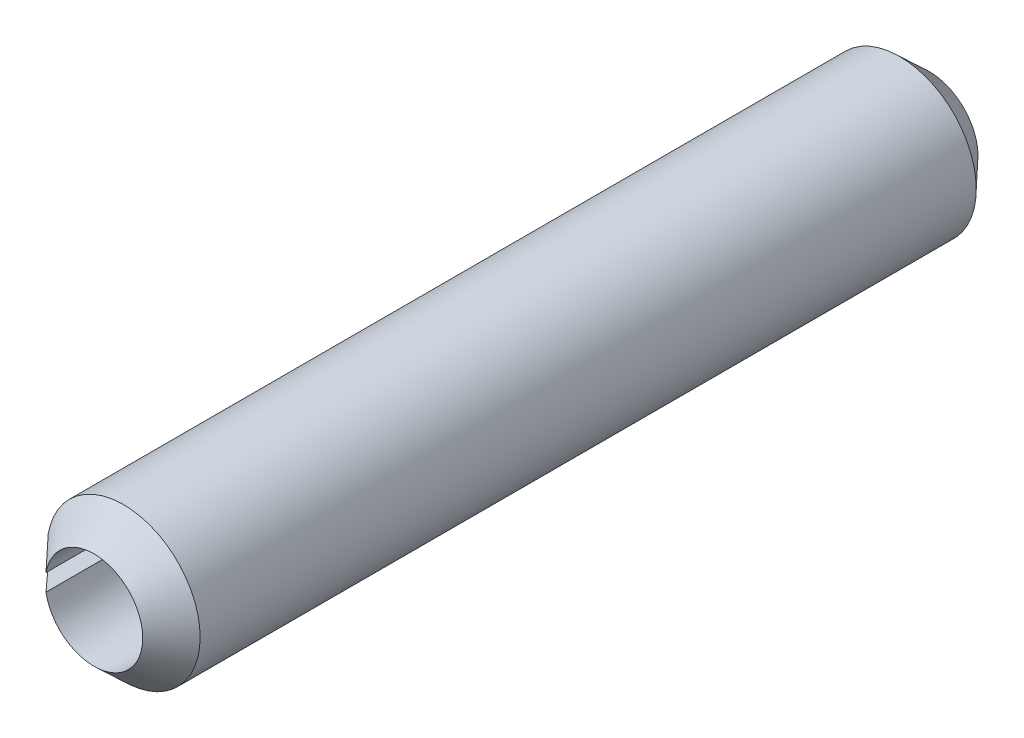
ISO-10303-21;
HEADER;
FILE_DESCRIPTION(('STEP AP214'),'2;1');
FILE_NAME('part.step','',(''),(''),'','','');
FILE_SCHEMA(('AUTOMOTIVE_DESIGN { 1 0 10303 214 1 1 1 1 }'));
ENDSEC;
DATA;
#1=APPLICATION_CONTEXT('core data for automotive mechanical design processes');
#2=APPLICATION_PROTOCOL_DEFINITION('international standard','automotive_design',2000,#1);
#3=PRODUCT_CONTEXT('',#1,'mechanical');
#4=PRODUCT('Part','Part','',(#3));
#5=PRODUCT_RELATED_PRODUCT_CATEGORY('part','',(#4));
#6=PRODUCT_DEFINITION_FORMATION('','',#4);
#7=PRODUCT_DEFINITION_CONTEXT('part definition',#1,'design');
#8=PRODUCT_DEFINITION('design','',#6,#7);
#9=PRODUCT_DEFINITION_SHAPE('','',#8);
#10=(LENGTH_UNIT() NAMED_UNIT(*) SI_UNIT(.MILLI.,.METRE.));
#11=(NAMED_UNIT(*) PLANE_ANGLE_UNIT() SI_UNIT($,.RADIAN.));
#12=(NAMED_UNIT(*) SI_UNIT($,.STERADIAN.) SOLID_ANGLE_UNIT());
#13=UNCERTAINTY_MEASURE_WITH_UNIT(LENGTH_MEASURE(1.E-05),#10,'distance_accuracy_value','');
#14=(GEOMETRIC_REPRESENTATION_CONTEXT(3) GLOBAL_UNCERTAINTY_ASSIGNED_CONTEXT((#13)) GLOBAL_UNIT_ASSIGNED_CONTEXT((#10,
#11,#12)) REPRESENTATION_CONTEXT('',''));
#15=CARTESIAN_POINT('',(0.,0.,0.));
#16=DIRECTION('',(0.,0.,1.));
#17=DIRECTION('',(1.,0.,0.));
#18=AXIS2_PLACEMENT_3D('',#15,#16,#17);
#19=CARTESIAN_POINT('',(0.,0.,12.));
#20=DIRECTION('',(0.,0.,-1.));
#21=DIRECTION('',(-1.,0.,0.));
#22=AXIS2_PLACEMENT_3D('',#19,#20,#21);
#23=CYLINDRICAL_SURFACE('',#22,1.4);
#24=CARTESIAN_POINT('',(0.,0.,-12.));
#25=DIRECTION('',(0.,0.,-1.));
#26=DIRECTION('',(1.,0.,0.));
#27=AXIS2_PLACEMENT_3D('',#24,#25,#26);
#28=CIRCLE('',#27,1.4);
#29=CARTESIAN_POINT('',(-1.37873085421709,0.243107448733698,-12.));
#30=VERTEX_POINT('',#29);
#31=CARTESIAN_POINT('',(-1.37873085421709,-0.243107448733698,-12.));
#32=VERTEX_POINT('',#31);
#33=EDGE_CURVE('E91',#30,#32,#28,.T.);
#34=ORIENTED_EDGE('',*,*,#33,.T.);
#35=DIRECTION('',(0.,0.,-1.));
#36=VECTOR('',#35,1.);
#37=CARTESIAN_POINT('',(-1.37873085421709,-0.243107448733698,12.));
#38=LINE('',#37,#36);
#39=CARTESIAN_POINT('',(-1.3787308542171,-0.243107448733699,12.));
#40=VERTEX_POINT('',#39);
#41=EDGE_CURVE('E11',#40,#32,#38,.T.);
#42=ORIENTED_EDGE('',*,*,#41,.F.);
#43=CARTESIAN_POINT('',(0.,0.,12.));
#44=DIRECTION('',(0.,0.,-1.));
#45=DIRECTION('',(1.,0.,0.));
#46=AXIS2_PLACEMENT_3D('',#43,#44,#45);
#47=CIRCLE('',#46,1.4);
#48=CARTESIAN_POINT('',(-1.37873085421709,0.243107448733698,12.));
#49=VERTEX_POINT('',#48);
#50=EDGE_CURVE('E88',#49,#40,#47,.T.);
#51=ORIENTED_EDGE('',*,*,#50,.F.);
#52=DIRECTION('',(0.,0.,-1.));
#53=VECTOR('',#52,1.);
#54=CARTESIAN_POINT('',(-1.37873085421709,0.243107448733698,12.));
#55=LINE('',#54,#53);
#56=EDGE_CURVE('E80',#49,#30,#55,.T.);
#57=ORIENTED_EDGE('',*,*,#56,.T.);
#58=EDGE_LOOP('',(#34,#42,#51,#57));
#59=FACE_BOUND('',#58,.T.);
#60=ADVANCED_FACE('F32',(#59),#23,.F.);
#61=CARTESIAN_POINT('',(-1.37873085421709,-0.243107448733698,12.));
#62=DIRECTION('',(0.173648177666928,-0.984807753012208,0.));
#63=DIRECTION('',(0.984807753012209,0.173648177666928,0.));
#64=AXIS2_PLACEMENT_3D('',#61,#62,#63);
#65=PLANE('',#64);
#66=DIRECTION('',(0.,0.,-1.));
#67=VECTOR('',#66,1.);
#68=CARTESIAN_POINT('',(-2.16657705662686,-0.382025990867239,12.));
#69=LINE('',#68,#67);
#70=CARTESIAN_POINT('',(-2.16657705662686,-0.38202599086724,11.15));
#71=VERTEX_POINT('',#70);
#72=CARTESIAN_POINT('',(-2.16657705662686,-0.38202599086724,-11.15));
#73=VERTEX_POINT('',#72);
#74=EDGE_CURVE('E40',#71,#73,#69,.T.);
#75=ORIENTED_EDGE('',*,*,#74,.F.);
#76=DIRECTION('',(-0.674952469220994,-0.119012331019459,-0.728199992692803));
#77=VECTOR('',#76,1.);
#78=CARTESIAN_POINT('',(0.,0.,13.4875));
#79=LINE('',#78,#77);
#80=EDGE_CURVE('E69',#71,#40,#79,.F.);
#81=ORIENTED_EDGE('',*,*,#80,.T.);
#82=ORIENTED_EDGE('',*,*,#41,.T.);
#83=DIRECTION('',(0.674952469220994,0.119012331019459,-0.728199992692803));
#84=VECTOR('',#83,1.);
#85=CARTESIAN_POINT('',(0.,0.,-13.4875));
#86=LINE('',#85,#84);
#87=EDGE_CURVE('E94',#32,#73,#86,.F.);
#88=ORIENTED_EDGE('',*,*,#87,.T.);
#89=EDGE_LOOP('',(#75,#81,#82,#88));
#90=FACE_BOUND('',#89,.T.);
#91=ADVANCED_FACE('F103',(#90),#65,.F.);
#92=CARTESIAN_POINT('',(0.,0.,12.));
#93=DIRECTION('',(0.,0.,-1.));
#94=DIRECTION('',(-1.,0.,0.));
#95=AXIS2_PLACEMENT_3D('',#92,#93,#94);
#96=CYLINDRICAL_SURFACE('',#95,2.2);
#97=DIRECTION('',(0.,0.,-1.));
#98=VECTOR('',#97,1.);
#99=CARTESIAN_POINT('',(-2.16657705662686,0.38202599086724,12.));
#100=LINE('',#99,#98);
#101=CARTESIAN_POINT('',(-2.16657705662686,0.382025990867241,11.15));
#102=VERTEX_POINT('',#101);
#103=CARTESIAN_POINT('',(-2.16657705662686,0.382025990867241,-11.15));
#104=VERTEX_POINT('',#103);
#105=EDGE_CURVE('E77',#102,#104,#100,.T.);
#106=ORIENTED_EDGE('',*,*,#105,.F.);
#107=CARTESIAN_POINT('',(0.,0.,11.15));
#108=DIRECTION('',(0.,0.,-1.));
#109=DIRECTION('',(-1.,0.,0.));
#110=AXIS2_PLACEMENT_3D('',#107,#108,#109);
#111=CIRCLE('',#110,2.2);
#112=EDGE_CURVE('E66',#102,#71,#111,.T.);
#113=ORIENTED_EDGE('',*,*,#112,.T.);
#114=ORIENTED_EDGE('',*,*,#74,.T.);
#115=CARTESIAN_POINT('',(0.,0.,-11.15));
#116=DIRECTION('',(0.,0.,-1.));
#117=DIRECTION('',(-1.,0.,0.));
#118=AXIS2_PLACEMENT_3D('',#115,#116,#117);
#119=CIRCLE('',#118,2.2);
#120=EDGE_CURVE('E86',#104,#73,#119,.T.);
#121=ORIENTED_EDGE('',*,*,#120,.F.);
#122=EDGE_LOOP('',(#106,#113,#114,#121));
#123=FACE_BOUND('',#122,.T.);
#124=ADVANCED_FACE('F84',(#123),#96,.T.);
#125=CARTESIAN_POINT('',(-2.16657705662686,0.38202599086724,12.));
#126=DIRECTION('',(0.173648177666928,0.984807753012208,0.));
#127=DIRECTION('',(-0.984807753012209,0.173648177666928,0.));
#128=AXIS2_PLACEMENT_3D('',#125,#126,#127);
#129=PLANE('',#128);
#130=ORIENTED_EDGE('',*,*,#56,.F.);
#131=DIRECTION('',(0.674952469220994,-0.119012331019459,0.728199992692803));
#132=VECTOR('',#131,1.);
#133=CARTESIAN_POINT('',(0.,0.,13.4875));
#134=LINE('',#133,#132);
#135=EDGE_CURVE('E46',#49,#102,#134,.F.);
#136=ORIENTED_EDGE('',*,*,#135,.T.);
#137=ORIENTED_EDGE('',*,*,#105,.T.);
#138=DIRECTION('',(-0.674952469220994,0.119012331019459,0.728199992692803));
#139=VECTOR('',#138,1.);
#140=CARTESIAN_POINT('',(0.,0.,-13.4875));
#141=LINE('',#140,#139);
#142=EDGE_CURVE('E98',#104,#30,#141,.F.);
#143=ORIENTED_EDGE('',*,*,#142,.T.);
#144=EDGE_LOOP('',(#130,#136,#137,#143));
#145=FACE_BOUND('',#144,.T.);
#146=ADVANCED_FACE('F75',(#145),#129,.F.);
#147=CARTESIAN_POINT('',(0.,0.,-11.15));
#148=DIRECTION('',(0.,0.,1.));
#149=DIRECTION('',(1.,0.,0.));
#150=AXIS2_PLACEMENT_3D('',#147,#148,#149);
#151=CONICAL_SURFACE('',#150,2.2,0.755104403478674);
#152=ORIENTED_EDGE('',*,*,#33,.F.);
#153=ORIENTED_EDGE('',*,*,#142,.F.);
#154=ORIENTED_EDGE('',*,*,#120,.T.);
#155=ORIENTED_EDGE('',*,*,#87,.F.);
#156=EDGE_LOOP('',(#152,#153,#154,#155));
#157=FACE_BOUND('',#156,.T.);
#158=ADVANCED_FACE('F106',(#157),#151,.T.);
#159=CARTESIAN_POINT('',(0.,0.,12.));
#160=DIRECTION('',(0.,0.,-1.));
#161=DIRECTION('',(-1.,0.,0.));
#162=AXIS2_PLACEMENT_3D('',#159,#160,#161);
#163=CONICAL_SURFACE('',#162,1.4,0.755104403478674);
#164=ORIENTED_EDGE('',*,*,#112,.F.);
#165=ORIENTED_EDGE('',*,*,#135,.F.);
#166=ORIENTED_EDGE('',*,*,#50,.T.);
#167=ORIENTED_EDGE('',*,*,#80,.F.);
#168=EDGE_LOOP('',(#164,#165,#166,#167));
#169=FACE_BOUND('',#168,.T.);
#170=ADVANCED_FACE('F67',(#169),#163,.T.);
#171=CLOSED_SHELL('',(#60,#91,#124,#146,#158,#170));
#172=MANIFOLD_SOLID_BREP('B2',#171);
#173=ADVANCED_BREP_SHAPE_REPRESENTATION('',(#18,#172),#14);
#174=SHAPE_DEFINITION_REPRESENTATION(#9,#173);
ENDSEC;
END-ISO-10303-21;
